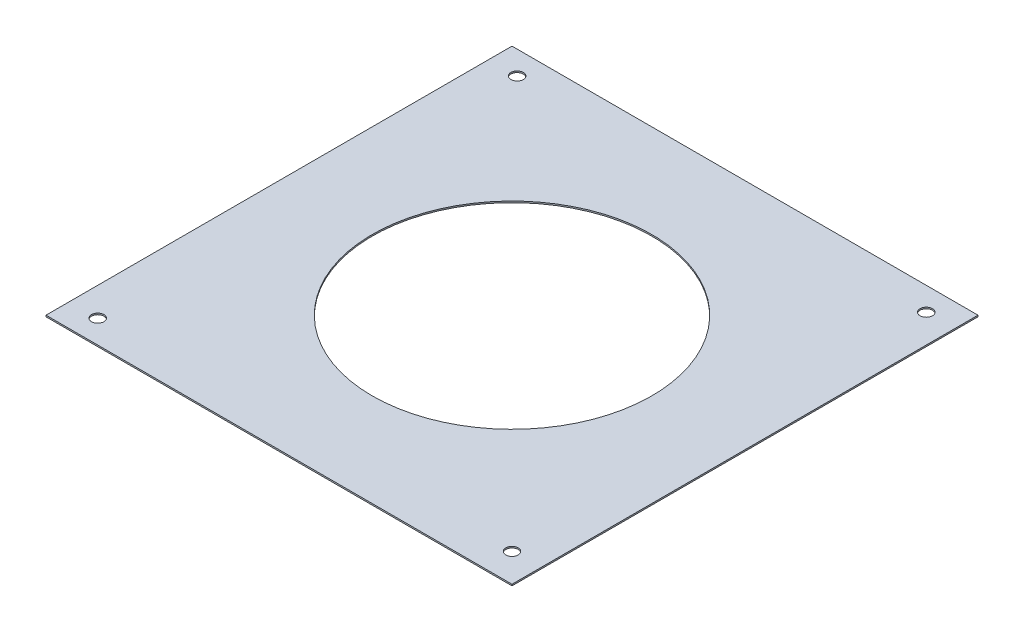
ISO-10303-21;
HEADER;
FILE_DESCRIPTION(('STEP AP214'),'2;1');
FILE_NAME('part.step','',(''),(''),'','','');
FILE_SCHEMA(('AUTOMOTIVE_DESIGN { 1 0 10303 214 1 1 1 1 }'));
ENDSEC;
DATA;
#1=APPLICATION_CONTEXT('core data for automotive mechanical design processes');
#2=APPLICATION_PROTOCOL_DEFINITION('international standard','automotive_design',2000,#1);
#3=PRODUCT_CONTEXT('',#1,'mechanical');
#4=PRODUCT('Part','Part','',(#3));
#5=PRODUCT_RELATED_PRODUCT_CATEGORY('part','',(#4));
#6=PRODUCT_DEFINITION_FORMATION('','',#4);
#7=PRODUCT_DEFINITION_CONTEXT('part definition',#1,'design');
#8=PRODUCT_DEFINITION('design','',#6,#7);
#9=PRODUCT_DEFINITION_SHAPE('','',#8);
#10=(LENGTH_UNIT() NAMED_UNIT(*) SI_UNIT(.MILLI.,.METRE.));
#11=(NAMED_UNIT(*) PLANE_ANGLE_UNIT() SI_UNIT($,.RADIAN.));
#12=(NAMED_UNIT(*) SI_UNIT($,.STERADIAN.) SOLID_ANGLE_UNIT());
#13=UNCERTAINTY_MEASURE_WITH_UNIT(LENGTH_MEASURE(1.E-05),#10,'distance_accuracy_value','');
#14=(GEOMETRIC_REPRESENTATION_CONTEXT(3) GLOBAL_UNCERTAINTY_ASSIGNED_CONTEXT((#13)) GLOBAL_UNIT_ASSIGNED_CONTEXT((#10,
#11,#12)) REPRESENTATION_CONTEXT('',''));
#15=CARTESIAN_POINT('',(0.,0.,0.));
#16=DIRECTION('',(0.,0.,1.));
#17=DIRECTION('',(1.,0.,0.));
#18=AXIS2_PLACEMENT_3D('',#15,#16,#17);
#19=CARTESIAN_POINT('',(0.,0.79375,0.));
#20=DIRECTION('',(0.,-1.,0.));
#21=DIRECTION('',(0.,0.,-1.));
#22=AXIS2_PLACEMENT_3D('',#19,#20,#21);
#23=PLANE('',#22);
#24=CARTESIAN_POINT('',(0.,0.79375,0.));
#25=DIRECTION('',(0.,1.,0.));
#26=DIRECTION('',(0.,0.,1.));
#27=AXIS2_PLACEMENT_3D('',#24,#25,#26);
#28=CIRCLE('',#27,76.2);
#29=CARTESIAN_POINT('',(0.,0.79375,76.2));
#30=VERTEX_POINT('',#29);
#31=EDGE_CURVE('E135',#30,#30,#28,.T.);
#32=ORIENTED_EDGE('',*,*,#31,.F.);
#33=EDGE_LOOP('',(#32));
#34=FACE_BOUND('',#33,.T.);
#35=CARTESIAN_POINT('',(111.506,0.79375,111.506));
#36=DIRECTION('',(0.,1.,0.));
#37=DIRECTION('',(0.,0.,1.));
#38=AXIS2_PLACEMENT_3D('',#35,#36,#37);
#39=CIRCLE('',#38,3.37819999999999);
#40=CARTESIAN_POINT('',(111.506,0.79375,114.8842));
#41=VERTEX_POINT('',#40);
#42=EDGE_CURVE('E120',#41,#41,#39,.T.);
#43=ORIENTED_EDGE('',*,*,#42,.F.);
#44=EDGE_LOOP('',(#43));
#45=FACE_BOUND('',#44,.T.);
#46=CARTESIAN_POINT('',(-111.506,0.79375,-114.3));
#47=DIRECTION('',(0.,1.,0.));
#48=DIRECTION('',(0.,0.,1.));
#49=AXIS2_PLACEMENT_3D('',#46,#47,#48);
#50=CIRCLE('',#49,3.37819999999999);
#51=CARTESIAN_POINT('',(-111.506,0.79375,-110.9218));
#52=VERTEX_POINT('',#51);
#53=EDGE_CURVE('E99',#52,#52,#50,.T.);
#54=ORIENTED_EDGE('',*,*,#53,.F.);
#55=EDGE_LOOP('',(#54));
#56=FACE_BOUND('',#55,.T.);
#57=DIRECTION('',(0.,0.,-1.));
#58=VECTOR('',#57,1.);
#59=CARTESIAN_POINT('',(127.,0.79375,127.));
#60=LINE('',#59,#58);
#61=CARTESIAN_POINT('',(127.,0.79375,127.));
#62=VERTEX_POINT('',#61);
#63=CARTESIAN_POINT('',(127.,0.79375,-127.));
#64=VERTEX_POINT('',#63);
#65=EDGE_CURVE('E84',#62,#64,#60,.T.);
#66=ORIENTED_EDGE('',*,*,#65,.T.);
#67=DIRECTION('',(-1.,0.,0.));
#68=VECTOR('',#67,1.);
#69=CARTESIAN_POINT('',(-127.,0.79375,-127.));
#70=LINE('',#69,#68);
#71=CARTESIAN_POINT('',(-127.,0.79375,-127.));
#72=VERTEX_POINT('',#71);
#73=EDGE_CURVE('E79',#64,#72,#70,.T.);
#74=ORIENTED_EDGE('',*,*,#73,.T.);
#75=DIRECTION('',(0.,0.,1.));
#76=VECTOR('',#75,1.);
#77=CARTESIAN_POINT('',(-127.,0.79375,127.));
#78=LINE('',#77,#76);
#79=CARTESIAN_POINT('',(-127.,0.79375,127.));
#80=VERTEX_POINT('',#79);
#81=EDGE_CURVE('E82',#72,#80,#78,.T.);
#82=ORIENTED_EDGE('',*,*,#81,.T.);
#83=DIRECTION('',(1.,0.,0.));
#84=VECTOR('',#83,1.);
#85=CARTESIAN_POINT('',(-127.,0.79375,127.));
#86=LINE('',#85,#84);
#87=EDGE_CURVE('E49',#80,#62,#86,.T.);
#88=ORIENTED_EDGE('',*,*,#87,.T.);
#89=EDGE_LOOP('',(#66,#74,#82,#88));
#90=FACE_BOUND('',#89,.T.);
#91=CARTESIAN_POINT('',(111.506,0.79375,-114.3));
#92=DIRECTION('',(0.,1.,0.));
#93=DIRECTION('',(0.,0.,1.));
#94=AXIS2_PLACEMENT_3D('',#91,#92,#93);
#95=CIRCLE('',#94,3.37819999999999);
#96=CARTESIAN_POINT('',(111.506,0.79375,-110.9218));
#97=VERTEX_POINT('',#96);
#98=EDGE_CURVE('E114',#97,#97,#95,.T.);
#99=ORIENTED_EDGE('',*,*,#98,.F.);
#100=EDGE_LOOP('',(#99));
#101=FACE_BOUND('',#100,.T.);
#102=CARTESIAN_POINT('',(-111.506,0.79375,114.3));
#103=DIRECTION('',(0.,1.,0.));
#104=DIRECTION('',(0.,0.,1.));
#105=AXIS2_PLACEMENT_3D('',#102,#103,#104);
#106=CIRCLE('',#105,3.37819999999999);
#107=CARTESIAN_POINT('',(-111.506,0.79375,117.6782));
#108=VERTEX_POINT('',#107);
#109=EDGE_CURVE('E126',#108,#108,#106,.T.);
#110=ORIENTED_EDGE('',*,*,#109,.F.);
#111=EDGE_LOOP('',(#110));
#112=FACE_BOUND('',#111,.T.);
#113=ADVANCED_FACE('F32',(#34,#45,#56,#90,#101,#112),#23,.F.);
#114=CARTESIAN_POINT('',(0.,0.,0.));
#115=DIRECTION('',(0.,-1.,0.));
#116=DIRECTION('',(0.,0.,-1.));
#117=AXIS2_PLACEMENT_3D('',#114,#115,#116);
#118=PLANE('',#117);
#119=CARTESIAN_POINT('',(0.,0.,0.));
#120=DIRECTION('',(0.,1.,0.));
#121=DIRECTION('',(0.,0.,1.));
#122=AXIS2_PLACEMENT_3D('',#119,#120,#121);
#123=CIRCLE('',#122,76.2);
#124=CARTESIAN_POINT('',(0.,0.,76.2));
#125=VERTEX_POINT('',#124);
#126=EDGE_CURVE('E132',#125,#125,#123,.T.);
#127=ORIENTED_EDGE('',*,*,#126,.T.);
#128=EDGE_LOOP('',(#127));
#129=FACE_BOUND('',#128,.T.);
#130=CARTESIAN_POINT('',(111.506,0.,111.506));
#131=DIRECTION('',(0.,1.,0.));
#132=DIRECTION('',(0.,0.,1.));
#133=AXIS2_PLACEMENT_3D('',#130,#131,#132);
#134=CIRCLE('',#133,3.37819999999999);
#135=CARTESIAN_POINT('',(111.506,0.,114.8842));
#136=VERTEX_POINT('',#135);
#137=EDGE_CURVE('E123',#136,#136,#134,.T.);
#138=ORIENTED_EDGE('',*,*,#137,.T.);
#139=EDGE_LOOP('',(#138));
#140=FACE_BOUND('',#139,.T.);
#141=CARTESIAN_POINT('',(-111.506,0.,-114.3));
#142=DIRECTION('',(0.,1.,0.));
#143=DIRECTION('',(0.,0.,1.));
#144=AXIS2_PLACEMENT_3D('',#141,#142,#143);
#145=CIRCLE('',#144,3.37819999999999);
#146=CARTESIAN_POINT('',(-111.506,0.,-110.9218));
#147=VERTEX_POINT('',#146);
#148=EDGE_CURVE('E111',#147,#147,#145,.T.);
#149=ORIENTED_EDGE('',*,*,#148,.T.);
#150=EDGE_LOOP('',(#149));
#151=FACE_BOUND('',#150,.T.);
#152=DIRECTION('',(0.,0.,-1.));
#153=VECTOR('',#152,1.);
#154=CARTESIAN_POINT('',(127.,0.,127.));
#155=LINE('',#154,#153);
#156=CARTESIAN_POINT('',(127.,0.,127.));
#157=VERTEX_POINT('',#156);
#158=CARTESIAN_POINT('',(127.,0.,-127.));
#159=VERTEX_POINT('',#158);
#160=EDGE_CURVE('E96',#157,#159,#155,.T.);
#161=ORIENTED_EDGE('',*,*,#160,.F.);
#162=DIRECTION('',(1.,0.,0.));
#163=VECTOR('',#162,1.);
#164=CARTESIAN_POINT('',(-127.,0.,127.));
#165=LINE('',#164,#163);
#166=CARTESIAN_POINT('',(-127.,0.,127.));
#167=VERTEX_POINT('',#166);
#168=EDGE_CURVE('E72',#167,#157,#165,.T.);
#169=ORIENTED_EDGE('',*,*,#168,.F.);
#170=DIRECTION('',(0.,0.,1.));
#171=VECTOR('',#170,1.);
#172=CARTESIAN_POINT('',(-127.,0.,127.));
#173=LINE('',#172,#171);
#174=CARTESIAN_POINT('',(-127.,0.,-127.));
#175=VERTEX_POINT('',#174);
#176=EDGE_CURVE('E66',#175,#167,#173,.T.);
#177=ORIENTED_EDGE('',*,*,#176,.F.);
#178=DIRECTION('',(-1.,0.,0.));
#179=VECTOR('',#178,1.);
#180=CARTESIAN_POINT('',(-127.,0.,-127.));
#181=LINE('',#180,#179);
#182=EDGE_CURVE('E88',#159,#175,#181,.T.);
#183=ORIENTED_EDGE('',*,*,#182,.F.);
#184=EDGE_LOOP('',(#161,#169,#177,#183));
#185=FACE_BOUND('',#184,.T.);
#186=CARTESIAN_POINT('',(111.506,0.,-114.3));
#187=DIRECTION('',(0.,1.,0.));
#188=DIRECTION('',(0.,0.,1.));
#189=AXIS2_PLACEMENT_3D('',#186,#187,#188);
#190=CIRCLE('',#189,3.37819999999999);
#191=CARTESIAN_POINT('',(111.506,0.,-110.9218));
#192=VERTEX_POINT('',#191);
#193=EDGE_CURVE('E117',#192,#192,#190,.T.);
#194=ORIENTED_EDGE('',*,*,#193,.T.);
#195=EDGE_LOOP('',(#194));
#196=FACE_BOUND('',#195,.T.);
#197=CARTESIAN_POINT('',(-111.506,0.,114.3));
#198=DIRECTION('',(0.,1.,0.));
#199=DIRECTION('',(0.,0.,1.));
#200=AXIS2_PLACEMENT_3D('',#197,#198,#199);
#201=CIRCLE('',#200,3.37819999999999);
#202=CARTESIAN_POINT('',(-111.506,0.,117.6782));
#203=VERTEX_POINT('',#202);
#204=EDGE_CURVE('E129',#203,#203,#201,.T.);
#205=ORIENTED_EDGE('',*,*,#204,.T.);
#206=EDGE_LOOP('',(#205));
#207=FACE_BOUND('',#206,.T.);
#208=ADVANCED_FACE('F107',(#129,#140,#151,#185,#196,#207),#118,.T.);
#209=CARTESIAN_POINT('',(127.,0.79375,127.));
#210=DIRECTION('',(-1.,0.,0.));
#211=DIRECTION('',(0.,0.,1.));
#212=AXIS2_PLACEMENT_3D('',#209,#210,#211);
#213=PLANE('',#212);
#214=ORIENTED_EDGE('',*,*,#160,.T.);
#215=DIRECTION('',(0.,-1.,0.));
#216=VECTOR('',#215,1.);
#217=CARTESIAN_POINT('',(127.,0.79375,-127.));
#218=LINE('',#217,#216);
#219=EDGE_CURVE('E11',#64,#159,#218,.T.);
#220=ORIENTED_EDGE('',*,*,#219,.F.);
#221=ORIENTED_EDGE('',*,*,#65,.F.);
#222=DIRECTION('',(0.,-1.,0.));
#223=VECTOR('',#222,1.);
#224=CARTESIAN_POINT('',(127.,0.79375,127.));
#225=LINE('',#224,#223);
#226=EDGE_CURVE('E92',#62,#157,#225,.T.);
#227=ORIENTED_EDGE('',*,*,#226,.T.);
#228=EDGE_LOOP('',(#214,#220,#221,#227));
#229=FACE_BOUND('',#228,.T.);
#230=ADVANCED_FACE('F34',(#229),#213,.F.);
#231=CARTESIAN_POINT('',(-127.,0.79375,-127.));
#232=DIRECTION('',(0.,0.,1.));
#233=DIRECTION('',(1.,0.,0.));
#234=AXIS2_PLACEMENT_3D('',#231,#232,#233);
#235=PLANE('',#234);
#236=ORIENTED_EDGE('',*,*,#182,.T.);
#237=DIRECTION('',(0.,-1.,0.));
#238=VECTOR('',#237,1.);
#239=CARTESIAN_POINT('',(-127.,0.79375,-127.));
#240=LINE('',#239,#238);
#241=EDGE_CURVE('E41',#72,#175,#240,.T.);
#242=ORIENTED_EDGE('',*,*,#241,.F.);
#243=ORIENTED_EDGE('',*,*,#73,.F.);
#244=ORIENTED_EDGE('',*,*,#219,.T.);
#245=EDGE_LOOP('',(#236,#242,#243,#244));
#246=FACE_BOUND('',#245,.T.);
#247=ADVANCED_FACE('F87',(#246),#235,.F.);
#248=CARTESIAN_POINT('',(-127.,0.79375,127.));
#249=DIRECTION('',(1.,0.,0.));
#250=DIRECTION('',(0.,0.,-1.));
#251=AXIS2_PLACEMENT_3D('',#248,#249,#250);
#252=PLANE('',#251);
#253=ORIENTED_EDGE('',*,*,#176,.T.);
#254=DIRECTION('',(0.,-1.,0.));
#255=VECTOR('',#254,1.);
#256=CARTESIAN_POINT('',(-127.,0.79375,127.));
#257=LINE('',#256,#255);
#258=EDGE_CURVE('E89',#80,#167,#257,.T.);
#259=ORIENTED_EDGE('',*,*,#258,.F.);
#260=ORIENTED_EDGE('',*,*,#81,.F.);
#261=ORIENTED_EDGE('',*,*,#241,.T.);
#262=EDGE_LOOP('',(#253,#259,#260,#261));
#263=FACE_BOUND('',#262,.T.);
#264=ADVANCED_FACE('F90',(#263),#252,.F.);
#265=CARTESIAN_POINT('',(-127.,0.79375,127.));
#266=DIRECTION('',(0.,0.,-1.));
#267=DIRECTION('',(-1.,0.,0.));
#268=AXIS2_PLACEMENT_3D('',#265,#266,#267);
#269=PLANE('',#268);
#270=ORIENTED_EDGE('',*,*,#168,.T.);
#271=ORIENTED_EDGE('',*,*,#226,.F.);
#272=ORIENTED_EDGE('',*,*,#87,.F.);
#273=ORIENTED_EDGE('',*,*,#258,.T.);
#274=EDGE_LOOP('',(#270,#271,#272,#273));
#275=FACE_BOUND('',#274,.T.);
#276=ADVANCED_FACE('F104',(#275),#269,.F.);
#277=CARTESIAN_POINT('',(-111.506,0.79375,-114.3));
#278=DIRECTION('',(0.,-1.,0.));
#279=DIRECTION('',(0.,0.,-1.));
#280=AXIS2_PLACEMENT_3D('',#277,#278,#279);
#281=CYLINDRICAL_SURFACE('',#280,3.37819999999999);
#282=ORIENTED_EDGE('',*,*,#53,.T.);
#283=EDGE_LOOP('',(#282));
#284=FACE_BOUND('',#283,.T.);
#285=ORIENTED_EDGE('',*,*,#148,.F.);
#286=EDGE_LOOP('',(#285));
#287=FACE_BOUND('',#286,.T.);
#288=ADVANCED_FACE('F157',(#284,#287),#281,.F.);
#289=CARTESIAN_POINT('',(111.506,0.79375,-114.3));
#290=DIRECTION('',(0.,-1.,0.));
#291=DIRECTION('',(0.,0.,-1.));
#292=AXIS2_PLACEMENT_3D('',#289,#290,#291);
#293=CYLINDRICAL_SURFACE('',#292,3.37819999999999);
#294=ORIENTED_EDGE('',*,*,#98,.T.);
#295=EDGE_LOOP('',(#294));
#296=FACE_BOUND('',#295,.T.);
#297=ORIENTED_EDGE('',*,*,#193,.F.);
#298=EDGE_LOOP('',(#297));
#299=FACE_BOUND('',#298,.T.);
#300=ADVANCED_FACE('F160',(#296,#299),#293,.F.);
#301=CARTESIAN_POINT('',(111.506,0.79375,111.506));
#302=DIRECTION('',(0.,-1.,0.));
#303=DIRECTION('',(0.,0.,-1.));
#304=AXIS2_PLACEMENT_3D('',#301,#302,#303);
#305=CYLINDRICAL_SURFACE('',#304,3.37819999999999);
#306=ORIENTED_EDGE('',*,*,#42,.T.);
#307=EDGE_LOOP('',(#306));
#308=FACE_BOUND('',#307,.T.);
#309=ORIENTED_EDGE('',*,*,#137,.F.);
#310=EDGE_LOOP('',(#309));
#311=FACE_BOUND('',#310,.T.);
#312=ADVANCED_FACE('F196',(#308,#311),#305,.F.);
#313=CARTESIAN_POINT('',(-111.506,0.79375,114.3));
#314=DIRECTION('',(0.,-1.,0.));
#315=DIRECTION('',(0.,0.,-1.));
#316=AXIS2_PLACEMENT_3D('',#313,#314,#315);
#317=CYLINDRICAL_SURFACE('',#316,3.37819999999999);
#318=ORIENTED_EDGE('',*,*,#109,.T.);
#319=EDGE_LOOP('',(#318));
#320=FACE_BOUND('',#319,.T.);
#321=ORIENTED_EDGE('',*,*,#204,.F.);
#322=EDGE_LOOP('',(#321));
#323=FACE_BOUND('',#322,.T.);
#324=ADVANCED_FACE('F146',(#320,#323),#317,.F.);
#325=CARTESIAN_POINT('',(0.,0.,0.));
#326=DIRECTION('',(0.,1.,0.));
#327=DIRECTION('',(0.,0.,1.));
#328=AXIS2_PLACEMENT_3D('',#325,#326,#327);
#329=CYLINDRICAL_SURFACE('',#328,76.2);
#330=ORIENTED_EDGE('',*,*,#126,.F.);
#331=EDGE_LOOP('',(#330));
#332=FACE_BOUND('',#331,.T.);
#333=ORIENTED_EDGE('',*,*,#31,.T.);
#334=EDGE_LOOP('',(#333));
#335=FACE_BOUND('',#334,.T.);
#336=ADVANCED_FACE('F143',(#332,#335),#329,.F.);
#337=CLOSED_SHELL('',(#113,#208,#230,#247,#264,#276,#288,#300,#312,#324,#336));
#338=MANIFOLD_SOLID_BREP('B2',#337);
#339=ADVANCED_BREP_SHAPE_REPRESENTATION('',(#18,#338),#14);
#340=SHAPE_DEFINITION_REPRESENTATION(#9,#339);
ENDSEC;
END-ISO-10303-21;
